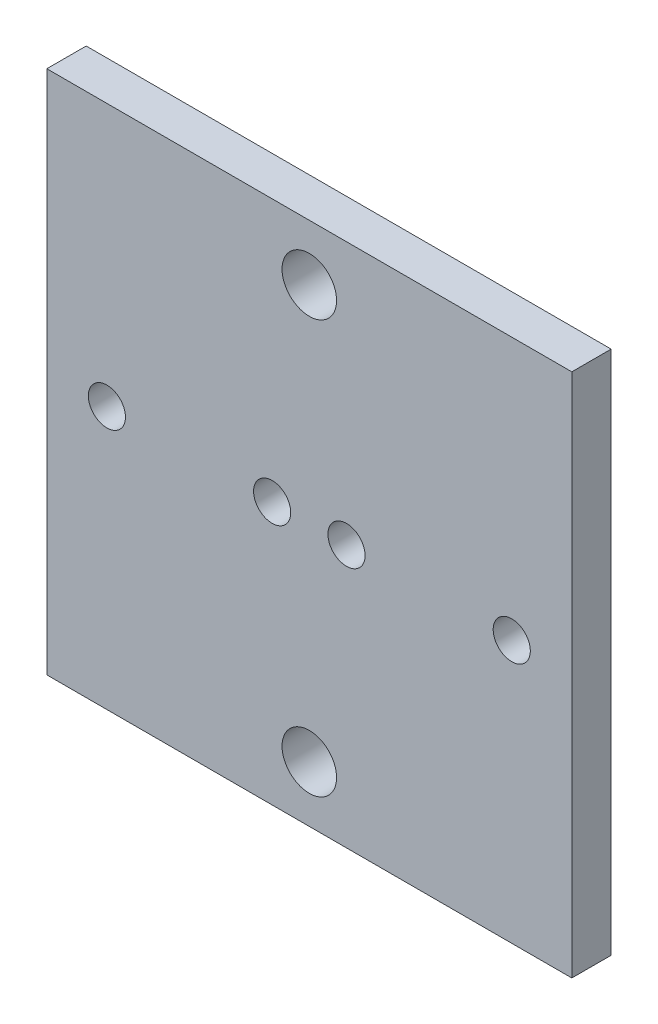
ISO-10303-21;
HEADER;
FILE_DESCRIPTION(('STEP AP214'),'2;1');
FILE_NAME('part.step','',(''),(''),'','','');
FILE_SCHEMA(('AUTOMOTIVE_DESIGN { 1 0 10303 214 1 1 1 1 }'));
ENDSEC;
DATA;
#1=APPLICATION_CONTEXT('core data for automotive mechanical design processes');
#2=APPLICATION_PROTOCOL_DEFINITION('international standard','automotive_design',2000,#1);
#3=PRODUCT_CONTEXT('',#1,'mechanical');
#4=PRODUCT('Part','Part','',(#3));
#5=PRODUCT_RELATED_PRODUCT_CATEGORY('part','',(#4));
#6=PRODUCT_DEFINITION_FORMATION('','',#4);
#7=PRODUCT_DEFINITION_CONTEXT('part definition',#1,'design');
#8=PRODUCT_DEFINITION('design','',#6,#7);
#9=PRODUCT_DEFINITION_SHAPE('','',#8);
#10=(LENGTH_UNIT() NAMED_UNIT(*) SI_UNIT(.MILLI.,.METRE.));
#11=(NAMED_UNIT(*) PLANE_ANGLE_UNIT() SI_UNIT($,.RADIAN.));
#12=(NAMED_UNIT(*) SI_UNIT($,.STERADIAN.) SOLID_ANGLE_UNIT());
#13=UNCERTAINTY_MEASURE_WITH_UNIT(LENGTH_MEASURE(1.E-05),#10,'distance_accuracy_value','');
#14=(GEOMETRIC_REPRESENTATION_CONTEXT(3) GLOBAL_UNCERTAINTY_ASSIGNED_CONTEXT((#13)) GLOBAL_UNIT_ASSIGNED_CONTEXT((#10,
#11,#12)) REPRESENTATION_CONTEXT('',''));
#15=CARTESIAN_POINT('',(0.,0.,0.));
#16=DIRECTION('',(0.,0.,1.));
#17=DIRECTION('',(1.,0.,0.));
#18=AXIS2_PLACEMENT_3D('',#15,#16,#17);
#19=CARTESIAN_POINT('',(-24.5,0.,4.7625));
#20=DIRECTION('',(0.,0.,-1.));
#21=DIRECTION('',(-1.,0.,0.));
#22=AXIS2_PLACEMENT_3D('',#19,#20,#21);
#23=CYLINDRICAL_SURFACE('',#22,2.2479);
#24=CARTESIAN_POINT('',(-24.5,0.,4.7625));
#25=DIRECTION('',(0.,0.,1.));
#26=DIRECTION('',(1.,0.,0.));
#27=AXIS2_PLACEMENT_3D('',#24,#25,#26);
#28=CIRCLE('',#27,2.2479);
#29=CARTESIAN_POINT('',(-26.7479,0.,4.7625));
#30=VERTEX_POINT('',#29);
#31=EDGE_CURVE('E51',#30,#30,#28,.T.);
#32=CARTESIAN_POINT('',(-24.5,0.,0.));
#33=DIRECTION('',(0.,0.,1.));
#34=DIRECTION('',(1.,0.,0.));
#35=AXIS2_PLACEMENT_3D('',#32,#33,#34);
#36=CIRCLE('',#35,2.2479);
#37=CARTESIAN_POINT('',(-26.7479,0.,0.));
#38=VERTEX_POINT('',#37);
#39=EDGE_CURVE('E168',#38,#38,#36,.T.);
#40=CARTESIAN_POINT('',(-26.7479,0.,4.7625));
#41=CARTESIAN_POINT('',(-26.7479,0.,4.712890625));
#42=CARTESIAN_POINT('',(-26.7479,0.,4.66328125));
#43=CARTESIAN_POINT('',(-26.7479,0.,4.5640625));
#44=CARTESIAN_POINT('',(-26.7479,0.,4.514453125));
#45=CARTESIAN_POINT('',(-26.7479,0.,4.415234375));
#46=CARTESIAN_POINT('',(-26.7479,0.,4.365625));
#47=CARTESIAN_POINT('',(-26.7479,0.,4.26640625));
#48=CARTESIAN_POINT('',(-26.7479,0.,4.216796875));
#49=CARTESIAN_POINT('',(-26.7479,0.,4.117578125));
#50=CARTESIAN_POINT('',(-26.7479,0.,4.06796875));
#51=CARTESIAN_POINT('',(-26.7479,0.,3.96875));
#52=CARTESIAN_POINT('',(-26.7479,0.,3.919140625));
#53=CARTESIAN_POINT('',(-26.7479,0.,3.819921875));
#54=CARTESIAN_POINT('',(-26.7479,0.,3.7703125));
#55=CARTESIAN_POINT('',(-26.7479,0.,3.67109375));
#56=CARTESIAN_POINT('',(-26.7479,0.,3.621484375));
#57=CARTESIAN_POINT('',(-26.7479,0.,3.522265625));
#58=CARTESIAN_POINT('',(-26.7479,0.,3.47265625));
#59=CARTESIAN_POINT('',(-26.7479,0.,3.3734375));
#60=CARTESIAN_POINT('',(-26.7479,0.,3.323828125));
#61=CARTESIAN_POINT('',(-26.7479,0.,3.224609375));
#62=CARTESIAN_POINT('',(-26.7479,0.,3.175));
#63=CARTESIAN_POINT('',(-26.7479,0.,3.07578125));
#64=CARTESIAN_POINT('',(-26.7479,0.,3.026171875));
#65=CARTESIAN_POINT('',(-26.7479,0.,2.926953125));
#66=CARTESIAN_POINT('',(-26.7479,0.,2.87734375));
#67=CARTESIAN_POINT('',(-26.7479,0.,2.778125));
#68=CARTESIAN_POINT('',(-26.7479,0.,2.728515625));
#69=CARTESIAN_POINT('',(-26.7479,0.,2.629296875));
#70=CARTESIAN_POINT('',(-26.7479,0.,2.5796875));
#71=CARTESIAN_POINT('',(-26.7479,0.,2.48046875));
#72=CARTESIAN_POINT('',(-26.7479,0.,2.430859375));
#73=CARTESIAN_POINT('',(-26.7479,0.,2.331640625));
#74=CARTESIAN_POINT('',(-26.7479,0.,2.28203125));
#75=CARTESIAN_POINT('',(-26.7479,0.,2.1828125));
#76=CARTESIAN_POINT('',(-26.7479,0.,2.133203125));
#77=CARTESIAN_POINT('',(-26.7479,0.,2.033984375));
#78=CARTESIAN_POINT('',(-26.7479,0.,1.984375));
#79=CARTESIAN_POINT('',(-26.7479,0.,1.88515625));
#80=CARTESIAN_POINT('',(-26.7479,0.,1.835546875));
#81=CARTESIAN_POINT('',(-26.7479,0.,1.736328125));
#82=CARTESIAN_POINT('',(-26.7479,0.,1.68671875));
#83=CARTESIAN_POINT('',(-26.7479,0.,1.5875));
#84=CARTESIAN_POINT('',(-26.7479,0.,1.537890625));
#85=CARTESIAN_POINT('',(-26.7479,0.,1.438671875));
#86=CARTESIAN_POINT('',(-26.7479,0.,1.3890625));
#87=CARTESIAN_POINT('',(-26.7479,0.,1.28984375));
#88=CARTESIAN_POINT('',(-26.7479,0.,1.240234375));
#89=CARTESIAN_POINT('',(-26.7479,0.,1.141015625));
#90=CARTESIAN_POINT('',(-26.7479,0.,1.09140625));
#91=CARTESIAN_POINT('',(-26.7479,0.,0.9921875));
#92=CARTESIAN_POINT('',(-26.7479,0.,0.942578125));
#93=CARTESIAN_POINT('',(-26.7479,0.,0.843359375));
#94=CARTESIAN_POINT('',(-26.7479,0.,0.79375));
#95=CARTESIAN_POINT('',(-26.7479,0.,0.69453125));
#96=CARTESIAN_POINT('',(-26.7479,0.,0.644921875));
#97=CARTESIAN_POINT('',(-26.7479,0.,0.545703125));
#98=CARTESIAN_POINT('',(-26.7479,0.,0.49609375));
#99=CARTESIAN_POINT('',(-26.7479,0.,0.396875));
#100=CARTESIAN_POINT('',(-26.7479,0.,0.347265625));
#101=CARTESIAN_POINT('',(-26.7479,0.,0.248046875));
#102=CARTESIAN_POINT('',(-26.7479,0.,0.1984375));
#103=CARTESIAN_POINT('',(-26.7479,0.,0.09921875));
#104=CARTESIAN_POINT('',(-26.7479,0.,0.049609375));
#105=CARTESIAN_POINT('',(-26.7479,0.,0.));
#106=B_SPLINE_CURVE_WITH_KNOTS('',3,(#40,#41,#42,#43,#44,#45,#46,#47,#48,#49,#50,#51,#52,#53,
#54,#55,#56,#57,#58,#59,#60,#61,#62,#63,#64,#65,#66,#67,#68,#69,#70,#71,#72,#73,#74,#75,#76,#77,
#78,#79,#80,#81,#82,#83,#84,#85,#86,#87,#88,#89,#90,#91,#92,#93,#94,#95,#96,#97,#98,#99,#100,
#101,#102,#103,#104,#105),.UNSPECIFIED.,.F.,.F.,(4,2,2,2,2,2,2,2,2,2,2,2,2,2,2,2,2,2,2,2,2,2,2,
2,2,2,2,2,2,2,2,2,4),(0.,0.148828124999999,0.297656249999999,0.446484374999999,
0.595312499999999,0.744140625,0.89296875,1.041796875,1.190625,1.339453125,1.48828125,
1.637109375,1.7859375,1.934765625,2.08359375,2.232421875,2.38125,2.530078125,2.67890625,
2.827734375,2.9765625,3.125390625,3.27421875,3.423046875,3.571875,3.720703125,3.86953125,
4.018359375,4.1671875,4.316015625,4.46484375,4.613671875,4.7625),.UNSPECIFIED.);
#107=EDGE_CURVE('BSEAM41',#30,#38,#106,.T.);
#108=ORIENTED_EDGE('',*,*,#31,.T.);
#109=ORIENTED_EDGE('',*,*,#39,.F.);
#110=ORIENTED_EDGE('',*,*,#107,.T.);
#111=ORIENTED_EDGE('',*,*,#107,.F.);
#112=EDGE_LOOP('',(#108,#110,#109,#111));
#113=FACE_BOUND('',#112,.T.);
#114=ADVANCED_FACE('F41',(#113),#23,.F.);
#115=CARTESIAN_POINT('',(-4.5,0.,4.7625));
#116=DIRECTION('',(0.,0.,-1.));
#117=DIRECTION('',(-1.,0.,0.));
#118=AXIS2_PLACEMENT_3D('',#115,#116,#117);
#119=CYLINDRICAL_SURFACE('',#118,2.2479);
#120=CARTESIAN_POINT('',(-4.5,0.,4.7625));
#121=DIRECTION('',(0.,0.,1.));
#122=DIRECTION('',(1.,0.,0.));
#123=AXIS2_PLACEMENT_3D('',#120,#121,#122);
#124=CIRCLE('',#123,2.2479);
#125=CARTESIAN_POINT('',(-6.7479,0.,4.7625));
#126=VERTEX_POINT('',#125);
#127=EDGE_CURVE('E147',#126,#126,#124,.T.);
#128=CARTESIAN_POINT('',(-4.5,0.,0.));
#129=DIRECTION('',(0.,0.,1.));
#130=DIRECTION('',(1.,0.,0.));
#131=AXIS2_PLACEMENT_3D('',#128,#129,#130);
#132=CIRCLE('',#131,2.2479);
#133=CARTESIAN_POINT('',(-6.7479,0.,0.));
#134=VERTEX_POINT('',#133);
#135=EDGE_CURVE('E165',#134,#134,#132,.T.);
#136=CARTESIAN_POINT('',(-6.7479,0.,4.7625));
#137=CARTESIAN_POINT('',(-6.7479,0.,4.712890625));
#138=CARTESIAN_POINT('',(-6.7479,0.,4.66328125));
#139=CARTESIAN_POINT('',(-6.7479,0.,4.5640625));
#140=CARTESIAN_POINT('',(-6.7479,0.,4.514453125));
#141=CARTESIAN_POINT('',(-6.7479,0.,4.415234375));
#142=CARTESIAN_POINT('',(-6.7479,0.,4.365625));
#143=CARTESIAN_POINT('',(-6.7479,0.,4.26640625));
#144=CARTESIAN_POINT('',(-6.7479,0.,4.216796875));
#145=CARTESIAN_POINT('',(-6.7479,0.,4.117578125));
#146=CARTESIAN_POINT('',(-6.7479,0.,4.06796875));
#147=CARTESIAN_POINT('',(-6.7479,0.,3.96875));
#148=CARTESIAN_POINT('',(-6.7479,0.,3.919140625));
#149=CARTESIAN_POINT('',(-6.7479,0.,3.819921875));
#150=CARTESIAN_POINT('',(-6.7479,0.,3.7703125));
#151=CARTESIAN_POINT('',(-6.7479,0.,3.67109375));
#152=CARTESIAN_POINT('',(-6.7479,0.,3.621484375));
#153=CARTESIAN_POINT('',(-6.7479,0.,3.522265625));
#154=CARTESIAN_POINT('',(-6.7479,0.,3.47265625));
#155=CARTESIAN_POINT('',(-6.7479,0.,3.3734375));
#156=CARTESIAN_POINT('',(-6.7479,0.,3.323828125));
#157=CARTESIAN_POINT('',(-6.7479,0.,3.224609375));
#158=CARTESIAN_POINT('',(-6.7479,0.,3.175));
#159=CARTESIAN_POINT('',(-6.7479,0.,3.07578125));
#160=CARTESIAN_POINT('',(-6.7479,0.,3.026171875));
#161=CARTESIAN_POINT('',(-6.7479,0.,2.926953125));
#162=CARTESIAN_POINT('',(-6.7479,0.,2.87734375));
#163=CARTESIAN_POINT('',(-6.7479,0.,2.778125));
#164=CARTESIAN_POINT('',(-6.7479,0.,2.728515625));
#165=CARTESIAN_POINT('',(-6.7479,0.,2.629296875));
#166=CARTESIAN_POINT('',(-6.7479,0.,2.5796875));
#167=CARTESIAN_POINT('',(-6.7479,0.,2.48046875));
#168=CARTESIAN_POINT('',(-6.7479,0.,2.430859375));
#169=CARTESIAN_POINT('',(-6.7479,0.,2.331640625));
#170=CARTESIAN_POINT('',(-6.7479,0.,2.28203125));
#171=CARTESIAN_POINT('',(-6.7479,0.,2.1828125));
#172=CARTESIAN_POINT('',(-6.7479,0.,2.133203125));
#173=CARTESIAN_POINT('',(-6.7479,0.,2.033984375));
#174=CARTESIAN_POINT('',(-6.7479,0.,1.984375));
#175=CARTESIAN_POINT('',(-6.7479,0.,1.88515625));
#176=CARTESIAN_POINT('',(-6.7479,0.,1.835546875));
#177=CARTESIAN_POINT('',(-6.7479,0.,1.736328125));
#178=CARTESIAN_POINT('',(-6.7479,0.,1.68671875));
#179=CARTESIAN_POINT('',(-6.7479,0.,1.5875));
#180=CARTESIAN_POINT('',(-6.7479,0.,1.537890625));
#181=CARTESIAN_POINT('',(-6.7479,0.,1.438671875));
#182=CARTESIAN_POINT('',(-6.7479,0.,1.3890625));
#183=CARTESIAN_POINT('',(-6.7479,0.,1.28984375));
#184=CARTESIAN_POINT('',(-6.7479,0.,1.240234375));
#185=CARTESIAN_POINT('',(-6.7479,0.,1.141015625));
#186=CARTESIAN_POINT('',(-6.7479,0.,1.09140625));
#187=CARTESIAN_POINT('',(-6.7479,0.,0.9921875));
#188=CARTESIAN_POINT('',(-6.7479,0.,0.942578125));
#189=CARTESIAN_POINT('',(-6.7479,0.,0.843359375));
#190=CARTESIAN_POINT('',(-6.7479,0.,0.79375));
#191=CARTESIAN_POINT('',(-6.7479,0.,0.69453125));
#192=CARTESIAN_POINT('',(-6.7479,0.,0.644921875));
#193=CARTESIAN_POINT('',(-6.7479,0.,0.545703125));
#194=CARTESIAN_POINT('',(-6.7479,0.,0.49609375));
#195=CARTESIAN_POINT('',(-6.7479,0.,0.396875));
#196=CARTESIAN_POINT('',(-6.7479,0.,0.347265625));
#197=CARTESIAN_POINT('',(-6.7479,0.,0.248046875));
#198=CARTESIAN_POINT('',(-6.7479,0.,0.1984375));
#199=CARTESIAN_POINT('',(-6.7479,0.,0.09921875));
#200=CARTESIAN_POINT('',(-6.7479,0.,0.049609375));
#201=CARTESIAN_POINT('',(-6.7479,0.,0.));
#202=B_SPLINE_CURVE_WITH_KNOTS('',3,(#136,#137,#138,#139,#140,#141,#142,#143,#144,#145,#146,
#147,#148,#149,#150,#151,#152,#153,#154,#155,#156,#157,#158,#159,#160,#161,#162,#163,#164,#165,
#166,#167,#168,#169,#170,#171,#172,#173,#174,#175,#176,#177,#178,#179,#180,#181,#182,#183,#184,
#185,#186,#187,#188,#189,#190,#191,#192,#193,#194,#195,#196,#197,#198,#199,#200,#201),
.UNSPECIFIED.,.F.,.F.,(4,2,2,2,2,2,2,2,2,2,2,2,2,2,2,2,2,2,2,2,2,2,2,2,2,2,2,2,2,2,2,2,4),(0.,
0.148828124999999,0.297656249999999,0.446484374999999,0.595312499999999,0.744140625,0.89296875,
1.041796875,1.190625,1.339453125,1.48828125,1.637109375,1.7859375,1.934765625,2.08359375,
2.232421875,2.38125,2.530078125,2.67890625,2.827734375,2.9765625,3.125390625,3.27421875,
3.423046875,3.571875,3.720703125,3.86953125,4.018359375,4.1671875,4.316015625,4.46484375,
4.613671875,4.7625),.UNSPECIFIED.);
#203=EDGE_CURVE('BSEAM193',#126,#134,#202,.T.);
#204=ORIENTED_EDGE('',*,*,#127,.T.);
#205=ORIENTED_EDGE('',*,*,#135,.F.);
#206=ORIENTED_EDGE('',*,*,#203,.T.);
#207=ORIENTED_EDGE('',*,*,#203,.F.);
#208=EDGE_LOOP('',(#204,#206,#205,#207));
#209=FACE_BOUND('',#208,.T.);
#210=ADVANCED_FACE('F193',(#209),#119,.F.);
#211=CARTESIAN_POINT('',(4.5,0.,4.7625));
#212=DIRECTION('',(0.,0.,-1.));
#213=DIRECTION('',(-1.,0.,0.));
#214=AXIS2_PLACEMENT_3D('',#211,#212,#213);
#215=CYLINDRICAL_SURFACE('',#214,2.2479);
#216=CARTESIAN_POINT('',(4.5,0.,4.7625));
#217=DIRECTION('',(0.,0.,1.));
#218=DIRECTION('',(1.,0.,0.));
#219=AXIS2_PLACEMENT_3D('',#216,#217,#218);
#220=CIRCLE('',#219,2.2479);
#221=CARTESIAN_POINT('',(2.2521,0.,4.7625));
#222=VERTEX_POINT('',#221);
#223=EDGE_CURVE('E143',#222,#222,#220,.T.);
#224=CARTESIAN_POINT('',(4.5,0.,0.));
#225=DIRECTION('',(0.,0.,1.));
#226=DIRECTION('',(1.,0.,0.));
#227=AXIS2_PLACEMENT_3D('',#224,#225,#226);
#228=CIRCLE('',#227,2.2479);
#229=CARTESIAN_POINT('',(2.2521,0.,0.));
#230=VERTEX_POINT('',#229);
#231=EDGE_CURVE('E161',#230,#230,#228,.T.);
#232=CARTESIAN_POINT('',(2.2521,0.,4.7625));
#233=CARTESIAN_POINT('',(2.2521,0.,4.712890625));
#234=CARTESIAN_POINT('',(2.2521,0.,4.66328125));
#235=CARTESIAN_POINT('',(2.2521,0.,4.5640625));
#236=CARTESIAN_POINT('',(2.2521,0.,4.514453125));
#237=CARTESIAN_POINT('',(2.2521,0.,4.415234375));
#238=CARTESIAN_POINT('',(2.2521,0.,4.365625));
#239=CARTESIAN_POINT('',(2.2521,0.,4.26640625));
#240=CARTESIAN_POINT('',(2.2521,0.,4.216796875));
#241=CARTESIAN_POINT('',(2.2521,0.,4.117578125));
#242=CARTESIAN_POINT('',(2.2521,0.,4.06796875));
#243=CARTESIAN_POINT('',(2.2521,0.,3.96875));
#244=CARTESIAN_POINT('',(2.2521,0.,3.919140625));
#245=CARTESIAN_POINT('',(2.2521,0.,3.819921875));
#246=CARTESIAN_POINT('',(2.2521,0.,3.7703125));
#247=CARTESIAN_POINT('',(2.2521,0.,3.67109375));
#248=CARTESIAN_POINT('',(2.2521,0.,3.621484375));
#249=CARTESIAN_POINT('',(2.2521,0.,3.522265625));
#250=CARTESIAN_POINT('',(2.2521,0.,3.47265625));
#251=CARTESIAN_POINT('',(2.2521,0.,3.3734375));
#252=CARTESIAN_POINT('',(2.2521,0.,3.323828125));
#253=CARTESIAN_POINT('',(2.2521,0.,3.224609375));
#254=CARTESIAN_POINT('',(2.2521,0.,3.175));
#255=CARTESIAN_POINT('',(2.2521,0.,3.07578125));
#256=CARTESIAN_POINT('',(2.2521,0.,3.026171875));
#257=CARTESIAN_POINT('',(2.2521,0.,2.926953125));
#258=CARTESIAN_POINT('',(2.2521,0.,2.87734375));
#259=CARTESIAN_POINT('',(2.2521,0.,2.778125));
#260=CARTESIAN_POINT('',(2.2521,0.,2.728515625));
#261=CARTESIAN_POINT('',(2.2521,0.,2.629296875));
#262=CARTESIAN_POINT('',(2.2521,0.,2.5796875));
#263=CARTESIAN_POINT('',(2.2521,0.,2.48046875));
#264=CARTESIAN_POINT('',(2.2521,0.,2.430859375));
#265=CARTESIAN_POINT('',(2.2521,0.,2.331640625));
#266=CARTESIAN_POINT('',(2.2521,0.,2.28203125));
#267=CARTESIAN_POINT('',(2.2521,0.,2.1828125));
#268=CARTESIAN_POINT('',(2.2521,0.,2.133203125));
#269=CARTESIAN_POINT('',(2.2521,0.,2.033984375));
#270=CARTESIAN_POINT('',(2.2521,0.,1.984375));
#271=CARTESIAN_POINT('',(2.2521,0.,1.88515625));
#272=CARTESIAN_POINT('',(2.2521,0.,1.835546875));
#273=CARTESIAN_POINT('',(2.2521,0.,1.736328125));
#274=CARTESIAN_POINT('',(2.2521,0.,1.68671875));
#275=CARTESIAN_POINT('',(2.2521,0.,1.5875));
#276=CARTESIAN_POINT('',(2.2521,0.,1.537890625));
#277=CARTESIAN_POINT('',(2.2521,0.,1.438671875));
#278=CARTESIAN_POINT('',(2.2521,0.,1.3890625));
#279=CARTESIAN_POINT('',(2.2521,0.,1.28984375));
#280=CARTESIAN_POINT('',(2.2521,0.,1.240234375));
#281=CARTESIAN_POINT('',(2.2521,0.,1.141015625));
#282=CARTESIAN_POINT('',(2.2521,0.,1.09140625));
#283=CARTESIAN_POINT('',(2.2521,0.,0.9921875));
#284=CARTESIAN_POINT('',(2.2521,0.,0.942578125));
#285=CARTESIAN_POINT('',(2.2521,0.,0.843359375));
#286=CARTESIAN_POINT('',(2.2521,0.,0.79375));
#287=CARTESIAN_POINT('',(2.2521,0.,0.69453125));
#288=CARTESIAN_POINT('',(2.2521,0.,0.644921875));
#289=CARTESIAN_POINT('',(2.2521,0.,0.545703125));
#290=CARTESIAN_POINT('',(2.2521,0.,0.49609375));
#291=CARTESIAN_POINT('',(2.2521,0.,0.396875));
#292=CARTESIAN_POINT('',(2.2521,0.,0.347265625));
#293=CARTESIAN_POINT('',(2.2521,0.,0.248046875));
#294=CARTESIAN_POINT('',(2.2521,0.,0.1984375));
#295=CARTESIAN_POINT('',(2.2521,0.,0.09921875));
#296=CARTESIAN_POINT('',(2.2521,0.,0.049609375));
#297=CARTESIAN_POINT('',(2.2521,0.,0.));
#298=B_SPLINE_CURVE_WITH_KNOTS('',3,(#232,#233,#234,#235,#236,#237,#238,#239,#240,#241,#242,
#243,#244,#245,#246,#247,#248,#249,#250,#251,#252,#253,#254,#255,#256,#257,#258,#259,#260,#261,
#262,#263,#264,#265,#266,#267,#268,#269,#270,#271,#272,#273,#274,#275,#276,#277,#278,#279,#280,
#281,#282,#283,#284,#285,#286,#287,#288,#289,#290,#291,#292,#293,#294,#295,#296,#297),
.UNSPECIFIED.,.F.,.F.,(4,2,2,2,2,2,2,2,2,2,2,2,2,2,2,2,2,2,2,2,2,2,2,2,2,2,2,2,2,2,2,2,4),(0.,
0.148828124999999,0.297656249999999,0.446484374999999,0.595312499999999,0.744140625,0.89296875,
1.041796875,1.190625,1.339453125,1.48828125,1.637109375,1.7859375,1.934765625,2.08359375,
2.232421875,2.38125,2.530078125,2.67890625,2.827734375,2.9765625,3.125390625,3.27421875,
3.423046875,3.571875,3.720703125,3.86953125,4.018359375,4.1671875,4.316015625,4.46484375,
4.613671875,4.7625),.UNSPECIFIED.);
#299=EDGE_CURVE('BSEAM198',#222,#230,#298,.T.);
#300=ORIENTED_EDGE('',*,*,#223,.T.);
#301=ORIENTED_EDGE('',*,*,#231,.F.);
#302=ORIENTED_EDGE('',*,*,#299,.T.);
#303=ORIENTED_EDGE('',*,*,#299,.F.);
#304=EDGE_LOOP('',(#300,#302,#301,#303));
#305=FACE_BOUND('',#304,.T.);
#306=ADVANCED_FACE('F198',(#305),#215,.F.);
#307=CARTESIAN_POINT('',(24.5,0.,4.7625));
#308=DIRECTION('',(0.,0.,-1.));
#309=DIRECTION('',(-1.,0.,0.));
#310=AXIS2_PLACEMENT_3D('',#307,#308,#309);
#311=CYLINDRICAL_SURFACE('',#310,2.2479);
#312=CARTESIAN_POINT('',(24.5,0.,4.7625));
#313=DIRECTION('',(0.,0.,1.));
#314=DIRECTION('',(1.,0.,0.));
#315=AXIS2_PLACEMENT_3D('',#312,#313,#314);
#316=CIRCLE('',#315,2.2479);
#317=CARTESIAN_POINT('',(22.2521,0.,4.7625));
#318=VERTEX_POINT('',#317);
#319=EDGE_CURVE('E139',#318,#318,#316,.T.);
#320=CARTESIAN_POINT('',(24.5,0.,0.));
#321=DIRECTION('',(0.,0.,1.));
#322=DIRECTION('',(1.,0.,0.));
#323=AXIS2_PLACEMENT_3D('',#320,#321,#322);
#324=CIRCLE('',#323,2.2479);
#325=CARTESIAN_POINT('',(22.2521,0.,0.));
#326=VERTEX_POINT('',#325);
#327=EDGE_CURVE('E157',#326,#326,#324,.T.);
#328=CARTESIAN_POINT('',(22.2521,0.,4.7625));
#329=CARTESIAN_POINT('',(22.2521,0.,4.712890625));
#330=CARTESIAN_POINT('',(22.2521,0.,4.66328125));
#331=CARTESIAN_POINT('',(22.2521,0.,4.5640625));
#332=CARTESIAN_POINT('',(22.2521,0.,4.514453125));
#333=CARTESIAN_POINT('',(22.2521,0.,4.415234375));
#334=CARTESIAN_POINT('',(22.2521,0.,4.365625));
#335=CARTESIAN_POINT('',(22.2521,0.,4.26640625));
#336=CARTESIAN_POINT('',(22.2521,0.,4.216796875));
#337=CARTESIAN_POINT('',(22.2521,0.,4.117578125));
#338=CARTESIAN_POINT('',(22.2521,0.,4.06796875));
#339=CARTESIAN_POINT('',(22.2521,0.,3.96875));
#340=CARTESIAN_POINT('',(22.2521,0.,3.919140625));
#341=CARTESIAN_POINT('',(22.2521,0.,3.819921875));
#342=CARTESIAN_POINT('',(22.2521,0.,3.7703125));
#343=CARTESIAN_POINT('',(22.2521,0.,3.67109375));
#344=CARTESIAN_POINT('',(22.2521,0.,3.621484375));
#345=CARTESIAN_POINT('',(22.2521,0.,3.522265625));
#346=CARTESIAN_POINT('',(22.2521,0.,3.47265625));
#347=CARTESIAN_POINT('',(22.2521,0.,3.3734375));
#348=CARTESIAN_POINT('',(22.2521,0.,3.323828125));
#349=CARTESIAN_POINT('',(22.2521,0.,3.224609375));
#350=CARTESIAN_POINT('',(22.2521,0.,3.175));
#351=CARTESIAN_POINT('',(22.2521,0.,3.07578125));
#352=CARTESIAN_POINT('',(22.2521,0.,3.026171875));
#353=CARTESIAN_POINT('',(22.2521,0.,2.926953125));
#354=CARTESIAN_POINT('',(22.2521,0.,2.87734375));
#355=CARTESIAN_POINT('',(22.2521,0.,2.778125));
#356=CARTESIAN_POINT('',(22.2521,0.,2.728515625));
#357=CARTESIAN_POINT('',(22.2521,0.,2.629296875));
#358=CARTESIAN_POINT('',(22.2521,0.,2.5796875));
#359=CARTESIAN_POINT('',(22.2521,0.,2.48046875));
#360=CARTESIAN_POINT('',(22.2521,0.,2.430859375));
#361=CARTESIAN_POINT('',(22.2521,0.,2.331640625));
#362=CARTESIAN_POINT('',(22.2521,0.,2.28203125));
#363=CARTESIAN_POINT('',(22.2521,0.,2.1828125));
#364=CARTESIAN_POINT('',(22.2521,0.,2.133203125));
#365=CARTESIAN_POINT('',(22.2521,0.,2.033984375));
#366=CARTESIAN_POINT('',(22.2521,0.,1.984375));
#367=CARTESIAN_POINT('',(22.2521,0.,1.88515625));
#368=CARTESIAN_POINT('',(22.2521,0.,1.835546875));
#369=CARTESIAN_POINT('',(22.2521,0.,1.736328125));
#370=CARTESIAN_POINT('',(22.2521,0.,1.68671875));
#371=CARTESIAN_POINT('',(22.2521,0.,1.5875));
#372=CARTESIAN_POINT('',(22.2521,0.,1.537890625));
#373=CARTESIAN_POINT('',(22.2521,0.,1.438671875));
#374=CARTESIAN_POINT('',(22.2521,0.,1.3890625));
#375=CARTESIAN_POINT('',(22.2521,0.,1.28984375));
#376=CARTESIAN_POINT('',(22.2521,0.,1.240234375));
#377=CARTESIAN_POINT('',(22.2521,0.,1.141015625));
#378=CARTESIAN_POINT('',(22.2521,0.,1.09140625));
#379=CARTESIAN_POINT('',(22.2521,0.,0.9921875));
#380=CARTESIAN_POINT('',(22.2521,0.,0.942578125));
#381=CARTESIAN_POINT('',(22.2521,0.,0.843359375));
#382=CARTESIAN_POINT('',(22.2521,0.,0.79375));
#383=CARTESIAN_POINT('',(22.2521,0.,0.69453125));
#384=CARTESIAN_POINT('',(22.2521,0.,0.644921875));
#385=CARTESIAN_POINT('',(22.2521,0.,0.545703125));
#386=CARTESIAN_POINT('',(22.2521,0.,0.49609375));
#387=CARTESIAN_POINT('',(22.2521,0.,0.396875));
#388=CARTESIAN_POINT('',(22.2521,0.,0.347265625));
#389=CARTESIAN_POINT('',(22.2521,0.,0.248046875));
#390=CARTESIAN_POINT('',(22.2521,0.,0.1984375));
#391=CARTESIAN_POINT('',(22.2521,0.,0.09921875));
#392=CARTESIAN_POINT('',(22.2521,0.,0.049609375));
#393=CARTESIAN_POINT('',(22.2521,0.,0.));
#394=B_SPLINE_CURVE_WITH_KNOTS('',3,(#328,#329,#330,#331,#332,#333,#334,#335,#336,#337,#338,
#339,#340,#341,#342,#343,#344,#345,#346,#347,#348,#349,#350,#351,#352,#353,#354,#355,#356,#357,
#358,#359,#360,#361,#362,#363,#364,#365,#366,#367,#368,#369,#370,#371,#372,#373,#374,#375,#376,
#377,#378,#379,#380,#381,#382,#383,#384,#385,#386,#387,#388,#389,#390,#391,#392,#393),
.UNSPECIFIED.,.F.,.F.,(4,2,2,2,2,2,2,2,2,2,2,2,2,2,2,2,2,2,2,2,2,2,2,2,2,2,2,2,2,2,2,2,4),(0.,
0.148828124999999,0.297656249999999,0.446484374999999,0.595312499999999,0.744140625,0.89296875,
1.041796875,1.190625,1.339453125,1.48828125,1.637109375,1.7859375,1.934765625,2.08359375,
2.232421875,2.38125,2.530078125,2.67890625,2.827734375,2.9765625,3.125390625,3.27421875,
3.423046875,3.571875,3.720703125,3.86953125,4.018359375,4.1671875,4.316015625,4.46484375,
4.613671875,4.7625),.UNSPECIFIED.);
#395=EDGE_CURVE('BSEAM188',#318,#326,#394,.T.);
#396=ORIENTED_EDGE('',*,*,#319,.T.);
#397=ORIENTED_EDGE('',*,*,#327,.F.);
#398=ORIENTED_EDGE('',*,*,#395,.T.);
#399=ORIENTED_EDGE('',*,*,#395,.F.);
#400=EDGE_LOOP('',(#396,#398,#397,#399));
#401=FACE_BOUND('',#400,.T.);
#402=ADVANCED_FACE('F188',(#401),#311,.F.);
#403=CARTESIAN_POINT('',(0.,-25.,4.7625));
#404=DIRECTION('',(0.,0.,-1.));
#405=DIRECTION('',(-1.,0.,0.));
#406=AXIS2_PLACEMENT_3D('',#403,#404,#405);
#407=CYLINDRICAL_SURFACE('',#406,3.3);
#408=CARTESIAN_POINT('',(0.,-25.,4.7625));
#409=DIRECTION('',(0.,0.,1.));
#410=DIRECTION('',(1.,0.,0.));
#411=AXIS2_PLACEMENT_3D('',#408,#409,#410);
#412=CIRCLE('',#411,3.3);
#413=CARTESIAN_POINT('',(-3.3,-25.,4.7625));
#414=VERTEX_POINT('',#413);
#415=EDGE_CURVE('E135',#414,#414,#412,.T.);
#416=CARTESIAN_POINT('',(0.,-25.,0.));
#417=DIRECTION('',(0.,0.,1.));
#418=DIRECTION('',(1.,0.,0.));
#419=AXIS2_PLACEMENT_3D('',#416,#417,#418);
#420=CIRCLE('',#419,3.3);
#421=CARTESIAN_POINT('',(-3.3,-25.,0.));
#422=VERTEX_POINT('',#421);
#423=EDGE_CURVE('E93',#422,#422,#420,.T.);
#424=CARTESIAN_POINT('',(-3.3,-25.,4.7625));
#425=CARTESIAN_POINT('',(-3.3,-25.,4.712890625));
#426=CARTESIAN_POINT('',(-3.3,-25.,4.66328125));
#427=CARTESIAN_POINT('',(-3.3,-25.,4.5640625));
#428=CARTESIAN_POINT('',(-3.3,-25.,4.514453125));
#429=CARTESIAN_POINT('',(-3.3,-25.,4.415234375));
#430=CARTESIAN_POINT('',(-3.3,-25.,4.365625));
#431=CARTESIAN_POINT('',(-3.3,-25.,4.26640625));
#432=CARTESIAN_POINT('',(-3.3,-25.,4.216796875));
#433=CARTESIAN_POINT('',(-3.3,-25.,4.117578125));
#434=CARTESIAN_POINT('',(-3.3,-25.,4.06796875));
#435=CARTESIAN_POINT('',(-3.3,-25.,3.96875));
#436=CARTESIAN_POINT('',(-3.3,-25.,3.919140625));
#437=CARTESIAN_POINT('',(-3.3,-25.,3.819921875));
#438=CARTESIAN_POINT('',(-3.3,-25.,3.7703125));
#439=CARTESIAN_POINT('',(-3.3,-25.,3.67109375));
#440=CARTESIAN_POINT('',(-3.3,-25.,3.621484375));
#441=CARTESIAN_POINT('',(-3.3,-25.,3.522265625));
#442=CARTESIAN_POINT('',(-3.3,-25.,3.47265625));
#443=CARTESIAN_POINT('',(-3.3,-25.,3.3734375));
#444=CARTESIAN_POINT('',(-3.3,-25.,3.323828125));
#445=CARTESIAN_POINT('',(-3.3,-25.,3.224609375));
#446=CARTESIAN_POINT('',(-3.3,-25.,3.175));
#447=CARTESIAN_POINT('',(-3.3,-25.,3.07578125));
#448=CARTESIAN_POINT('',(-3.3,-25.,3.026171875));
#449=CARTESIAN_POINT('',(-3.3,-25.,2.926953125));
#450=CARTESIAN_POINT('',(-3.3,-25.,2.87734375));
#451=CARTESIAN_POINT('',(-3.3,-25.,2.778125));
#452=CARTESIAN_POINT('',(-3.3,-25.,2.728515625));
#453=CARTESIAN_POINT('',(-3.3,-25.,2.629296875));
#454=CARTESIAN_POINT('',(-3.3,-25.,2.5796875));
#455=CARTESIAN_POINT('',(-3.3,-25.,2.48046875));
#456=CARTESIAN_POINT('',(-3.3,-25.,2.430859375));
#457=CARTESIAN_POINT('',(-3.3,-25.,2.331640625));
#458=CARTESIAN_POINT('',(-3.3,-25.,2.28203125));
#459=CARTESIAN_POINT('',(-3.3,-25.,2.1828125));
#460=CARTESIAN_POINT('',(-3.3,-25.,2.133203125));
#461=CARTESIAN_POINT('',(-3.3,-25.,2.033984375));
#462=CARTESIAN_POINT('',(-3.3,-25.,1.984375));
#463=CARTESIAN_POINT('',(-3.3,-25.,1.88515625));
#464=CARTESIAN_POINT('',(-3.3,-25.,1.835546875));
#465=CARTESIAN_POINT('',(-3.3,-25.,1.736328125));
#466=CARTESIAN_POINT('',(-3.3,-25.,1.68671875));
#467=CARTESIAN_POINT('',(-3.3,-25.,1.5875));
#468=CARTESIAN_POINT('',(-3.3,-25.,1.537890625));
#469=CARTESIAN_POINT('',(-3.3,-25.,1.438671875));
#470=CARTESIAN_POINT('',(-3.3,-25.,1.3890625));
#471=CARTESIAN_POINT('',(-3.3,-25.,1.28984375));
#472=CARTESIAN_POINT('',(-3.3,-25.,1.240234375));
#473=CARTESIAN_POINT('',(-3.3,-25.,1.141015625));
#474=CARTESIAN_POINT('',(-3.3,-25.,1.09140625));
#475=CARTESIAN_POINT('',(-3.3,-25.,0.992187499999999));
#476=CARTESIAN_POINT('',(-3.3,-25.,0.942578124999999));
#477=CARTESIAN_POINT('',(-3.3,-25.,0.843359375));
#478=CARTESIAN_POINT('',(-3.3,-25.,0.79375));
#479=CARTESIAN_POINT('',(-3.3,-25.,0.69453125));
#480=CARTESIAN_POINT('',(-3.3,-25.,0.644921875));
#481=CARTESIAN_POINT('',(-3.3,-25.,0.545703125));
#482=CARTESIAN_POINT('',(-3.3,-25.,0.49609375));
#483=CARTESIAN_POINT('',(-3.3,-25.,0.396875));
#484=CARTESIAN_POINT('',(-3.3,-25.,0.347265625));
#485=CARTESIAN_POINT('',(-3.3,-25.,0.248046875));
#486=CARTESIAN_POINT('',(-3.3,-25.,0.1984375));
#487=CARTESIAN_POINT('',(-3.3,-25.,0.09921875));
#488=CARTESIAN_POINT('',(-3.3,-25.,0.049609375));
#489=CARTESIAN_POINT('',(-3.3,-25.,0.));
#490=B_SPLINE_CURVE_WITH_KNOTS('',3,(#424,#425,#426,#427,#428,#429,#430,#431,#432,#433,#434,
#435,#436,#437,#438,#439,#440,#441,#442,#443,#444,#445,#446,#447,#448,#449,#450,#451,#452,#453,
#454,#455,#456,#457,#458,#459,#460,#461,#462,#463,#464,#465,#466,#467,#468,#469,#470,#471,#472,
#473,#474,#475,#476,#477,#478,#479,#480,#481,#482,#483,#484,#485,#486,#487,#488,#489),
.UNSPECIFIED.,.F.,.F.,(4,2,2,2,2,2,2,2,2,2,2,2,2,2,2,2,2,2,2,2,2,2,2,2,2,2,2,2,2,2,2,2,4),(0.,
0.148828125,0.29765625,0.446484375,0.5953125,0.744140625,0.892968750000001,1.041796875,1.190625,
1.339453125,1.48828125,1.637109375,1.7859375,1.934765625,2.08359375,2.232421875,2.38125,
2.530078125,2.67890625,2.827734375,2.9765625,3.125390625,3.27421875,3.423046875,3.571875,
3.720703125,3.86953125,4.018359375,4.1671875,4.316015625,4.46484375,4.613671875,4.7625),.UNSPECIFIED.);
#491=EDGE_CURVE('BSEAM43',#414,#422,#490,.T.);
#492=ORIENTED_EDGE('',*,*,#415,.T.);
#493=ORIENTED_EDGE('',*,*,#423,.F.);
#494=ORIENTED_EDGE('',*,*,#491,.T.);
#495=ORIENTED_EDGE('',*,*,#491,.F.);
#496=EDGE_LOOP('',(#492,#494,#493,#495));
#497=FACE_BOUND('',#496,.T.);
#498=ADVANCED_FACE('F43',(#497),#407,.F.);
#499=CARTESIAN_POINT('',(0.,25.,4.7625));
#500=DIRECTION('',(0.,0.,-1.));
#501=DIRECTION('',(-1.,0.,0.));
#502=AXIS2_PLACEMENT_3D('',#499,#500,#501);
#503=CYLINDRICAL_SURFACE('',#502,3.3);
#504=CARTESIAN_POINT('',(0.,25.,4.7625));
#505=DIRECTION('',(0.,0.,1.));
#506=DIRECTION('',(1.,0.,0.));
#507=AXIS2_PLACEMENT_3D('',#504,#505,#506);
#508=CIRCLE('',#507,3.3);
#509=CARTESIAN_POINT('',(-3.3,25.,4.7625));
#510=VERTEX_POINT('',#509);
#511=EDGE_CURVE('E11',#510,#510,#508,.T.);
#512=CARTESIAN_POINT('',(0.,25.,0.));
#513=DIRECTION('',(0.,0.,1.));
#514=DIRECTION('',(1.,0.,0.));
#515=AXIS2_PLACEMENT_3D('',#512,#513,#514);
#516=CIRCLE('',#515,3.3);
#517=CARTESIAN_POINT('',(-3.3,25.,0.));
#518=VERTEX_POINT('',#517);
#519=EDGE_CURVE('E45',#518,#518,#516,.T.);
#520=CARTESIAN_POINT('',(-3.3,25.,4.7625));
#521=CARTESIAN_POINT('',(-3.3,25.,4.712890625));
#522=CARTESIAN_POINT('',(-3.3,25.,4.66328125));
#523=CARTESIAN_POINT('',(-3.3,25.,4.5640625));
#524=CARTESIAN_POINT('',(-3.3,25.,4.514453125));
#525=CARTESIAN_POINT('',(-3.3,25.,4.415234375));
#526=CARTESIAN_POINT('',(-3.3,25.,4.365625));
#527=CARTESIAN_POINT('',(-3.3,25.,4.26640625));
#528=CARTESIAN_POINT('',(-3.3,25.,4.216796875));
#529=CARTESIAN_POINT('',(-3.3,25.,4.117578125));
#530=CARTESIAN_POINT('',(-3.3,25.,4.06796875));
#531=CARTESIAN_POINT('',(-3.3,25.,3.96875));
#532=CARTESIAN_POINT('',(-3.3,25.,3.919140625));
#533=CARTESIAN_POINT('',(-3.3,25.,3.819921875));
#534=CARTESIAN_POINT('',(-3.3,25.,3.7703125));
#535=CARTESIAN_POINT('',(-3.3,25.,3.67109375));
#536=CARTESIAN_POINT('',(-3.3,25.,3.621484375));
#537=CARTESIAN_POINT('',(-3.3,25.,3.522265625));
#538=CARTESIAN_POINT('',(-3.3,25.,3.47265625));
#539=CARTESIAN_POINT('',(-3.3,25.,3.3734375));
#540=CARTESIAN_POINT('',(-3.3,25.,3.323828125));
#541=CARTESIAN_POINT('',(-3.3,25.,3.224609375));
#542=CARTESIAN_POINT('',(-3.3,25.,3.175));
#543=CARTESIAN_POINT('',(-3.3,25.,3.07578125));
#544=CARTESIAN_POINT('',(-3.3,25.,3.026171875));
#545=CARTESIAN_POINT('',(-3.3,25.,2.926953125));
#546=CARTESIAN_POINT('',(-3.3,25.,2.87734375));
#547=CARTESIAN_POINT('',(-3.3,25.,2.778125));
#548=CARTESIAN_POINT('',(-3.3,25.,2.728515625));
#549=CARTESIAN_POINT('',(-3.3,25.,2.629296875));
#550=CARTESIAN_POINT('',(-3.3,25.,2.5796875));
#551=CARTESIAN_POINT('',(-3.3,25.,2.48046875));
#552=CARTESIAN_POINT('',(-3.3,25.,2.430859375));
#553=CARTESIAN_POINT('',(-3.3,25.,2.331640625));
#554=CARTESIAN_POINT('',(-3.3,25.,2.28203125));
#555=CARTESIAN_POINT('',(-3.3,25.,2.1828125));
#556=CARTESIAN_POINT('',(-3.3,25.,2.133203125));
#557=CARTESIAN_POINT('',(-3.3,25.,2.033984375));
#558=CARTESIAN_POINT('',(-3.3,25.,1.984375));
#559=CARTESIAN_POINT('',(-3.3,25.,1.88515625));
#560=CARTESIAN_POINT('',(-3.3,25.,1.835546875));
#561=CARTESIAN_POINT('',(-3.3,25.,1.736328125));
#562=CARTESIAN_POINT('',(-3.3,25.,1.68671875));
#563=CARTESIAN_POINT('',(-3.3,25.,1.5875));
#564=CARTESIAN_POINT('',(-3.3,25.,1.537890625));
#565=CARTESIAN_POINT('',(-3.3,25.,1.438671875));
#566=CARTESIAN_POINT('',(-3.3,25.,1.3890625));
#567=CARTESIAN_POINT('',(-3.3,25.,1.28984375));
#568=CARTESIAN_POINT('',(-3.3,25.,1.240234375));
#569=CARTESIAN_POINT('',(-3.3,25.,1.141015625));
#570=CARTESIAN_POINT('',(-3.3,25.,1.09140625));
#571=CARTESIAN_POINT('',(-3.3,25.,0.992187499999999));
#572=CARTESIAN_POINT('',(-3.3,25.,0.942578124999999));
#573=CARTESIAN_POINT('',(-3.3,25.,0.843359375));
#574=CARTESIAN_POINT('',(-3.3,25.,0.79375));
#575=CARTESIAN_POINT('',(-3.3,25.,0.69453125));
#576=CARTESIAN_POINT('',(-3.3,25.,0.644921875));
#577=CARTESIAN_POINT('',(-3.3,25.,0.545703125));
#578=CARTESIAN_POINT('',(-3.3,25.,0.49609375));
#579=CARTESIAN_POINT('',(-3.3,25.,0.396875));
#580=CARTESIAN_POINT('',(-3.3,25.,0.347265625));
#581=CARTESIAN_POINT('',(-3.3,25.,0.248046875));
#582=CARTESIAN_POINT('',(-3.3,25.,0.1984375));
#583=CARTESIAN_POINT('',(-3.3,25.,0.09921875));
#584=CARTESIAN_POINT('',(-3.3,25.,0.049609375));
#585=CARTESIAN_POINT('',(-3.3,25.,0.));
#586=B_SPLINE_CURVE_WITH_KNOTS('',3,(#520,#521,#522,#523,#524,#525,#526,#527,#528,#529,#530,
#531,#532,#533,#534,#535,#536,#537,#538,#539,#540,#541,#542,#543,#544,#545,#546,#547,#548,#549,
#550,#551,#552,#553,#554,#555,#556,#557,#558,#559,#560,#561,#562,#563,#564,#565,#566,#567,#568,
#569,#570,#571,#572,#573,#574,#575,#576,#577,#578,#579,#580,#581,#582,#583,#584,#585),
.UNSPECIFIED.,.F.,.F.,(4,2,2,2,2,2,2,2,2,2,2,2,2,2,2,2,2,2,2,2,2,2,2,2,2,2,2,2,2,2,2,2,4),(0.,
0.148828125,0.29765625,0.446484375,0.5953125,0.744140625,0.892968750000001,1.041796875,1.190625,
1.339453125,1.48828125,1.637109375,1.7859375,1.934765625,2.08359375,2.232421875,2.38125,
2.530078125,2.67890625,2.827734375,2.9765625,3.125390625,3.27421875,3.423046875,3.571875,
3.720703125,3.86953125,4.018359375,4.1671875,4.316015625,4.46484375,4.613671875,4.7625),.UNSPECIFIED.);
#587=EDGE_CURVE('BSEAM179',#510,#518,#586,.T.);
#588=ORIENTED_EDGE('',*,*,#511,.T.);
#589=ORIENTED_EDGE('',*,*,#519,.F.);
#590=ORIENTED_EDGE('',*,*,#587,.T.);
#591=ORIENTED_EDGE('',*,*,#587,.F.);
#592=EDGE_LOOP('',(#588,#590,#589,#591));
#593=FACE_BOUND('',#592,.T.);
#594=ADVANCED_FACE('F179',(#593),#503,.F.);
#595=CARTESIAN_POINT('',(0.,0.,4.7625));
#596=DIRECTION('',(0.,0.,1.));
#597=DIRECTION('',(1.,0.,0.));
#598=AXIS2_PLACEMENT_3D('',#595,#596,#597);
#599=PLANE('',#598);
#600=DIRECTION('',(0.,1.,0.));
#601=VECTOR('',#600,1.);
#602=CARTESIAN_POINT('',(-31.77,-30.5,4.7625));
#603=LINE('',#602,#601);
#604=CARTESIAN_POINT('',(-31.77,-31.77,4.7625));
#605=VERTEX_POINT('',#604);
#606=CARTESIAN_POINT('',(-31.77,31.77,4.7625));
#607=VERTEX_POINT('',#606);
#608=EDGE_CURVE('E59',#605,#607,#603,.T.);
#609=ORIENTED_EDGE('',*,*,#608,.F.);
#610=DIRECTION('',(-1.,0.,0.));
#611=VECTOR('',#610,1.);
#612=CARTESIAN_POINT('',(-31.77,-31.77,4.7625));
#613=LINE('',#612,#611);
#614=CARTESIAN_POINT('',(31.77,-31.77,4.7625));
#615=VERTEX_POINT('',#614);
#616=EDGE_CURVE('E125',#615,#605,#613,.T.);
#617=ORIENTED_EDGE('',*,*,#616,.F.);
#618=DIRECTION('',(0.,-1.,0.));
#619=VECTOR('',#618,1.);
#620=CARTESIAN_POINT('',(31.77,-30.5,4.7625));
#621=LINE('',#620,#619);
#622=CARTESIAN_POINT('',(31.77,31.77,4.7625));
#623=VERTEX_POINT('',#622);
#624=EDGE_CURVE('E67',#623,#615,#621,.T.);
#625=ORIENTED_EDGE('',*,*,#624,.F.);
#626=DIRECTION('',(1.,0.,0.));
#627=VECTOR('',#626,1.);
#628=CARTESIAN_POINT('',(-31.77,31.77,4.7625));
#629=LINE('',#628,#627);
#630=EDGE_CURVE('E97',#607,#623,#629,.T.);
#631=ORIENTED_EDGE('',*,*,#630,.F.);
#632=EDGE_LOOP('',(#609,#617,#625,#631));
#633=FACE_BOUND('',#632,.T.);
#634=ORIENTED_EDGE('',*,*,#415,.F.);
#635=EDGE_LOOP('',(#634));
#636=FACE_BOUND('',#635,.T.);
#637=ORIENTED_EDGE('',*,*,#319,.F.);
#638=EDGE_LOOP('',(#637));
#639=FACE_BOUND('',#638,.T.);
#640=ORIENTED_EDGE('',*,*,#223,.F.);
#641=EDGE_LOOP('',(#640));
#642=FACE_BOUND('',#641,.T.);
#643=ORIENTED_EDGE('',*,*,#127,.F.);
#644=EDGE_LOOP('',(#643));
#645=FACE_BOUND('',#644,.T.);
#646=ORIENTED_EDGE('',*,*,#31,.F.);
#647=EDGE_LOOP('',(#646));
#648=FACE_BOUND('',#647,.T.);
#649=ORIENTED_EDGE('',*,*,#511,.F.);
#650=EDGE_LOOP('',(#649));
#651=FACE_BOUND('',#650,.T.);
#652=ADVANCED_FACE('F98',(#633,#636,#639,#642,#645,#648,#651),#599,.T.);
#653=CARTESIAN_POINT('',(0.,0.,0.));
#654=DIRECTION('',(0.,0.,1.));
#655=DIRECTION('',(1.,0.,0.));
#656=AXIS2_PLACEMENT_3D('',#653,#654,#655);
#657=PLANE('',#656);
#658=DIRECTION('',(0.,1.,0.));
#659=VECTOR('',#658,1.);
#660=CARTESIAN_POINT('',(31.77,-30.5,0.));
#661=LINE('',#660,#659);
#662=CARTESIAN_POINT('',(31.77,-31.77,0.));
#663=VERTEX_POINT('',#662);
#664=CARTESIAN_POINT('',(31.77,31.77,0.));
#665=VERTEX_POINT('',#664);
#666=EDGE_CURVE('E130',#663,#665,#661,.T.);
#667=ORIENTED_EDGE('',*,*,#666,.F.);
#668=DIRECTION('',(1.,0.,0.));
#669=VECTOR('',#668,1.);
#670=CARTESIAN_POINT('',(-31.77,-31.77,0.));
#671=LINE('',#670,#669);
#672=CARTESIAN_POINT('',(-31.77,-31.77,0.));
#673=VERTEX_POINT('',#672);
#674=EDGE_CURVE('E118',#673,#663,#671,.T.);
#675=ORIENTED_EDGE('',*,*,#674,.F.);
#676=DIRECTION('',(0.,-1.,0.));
#677=VECTOR('',#676,1.);
#678=CARTESIAN_POINT('',(-31.77,-30.5,0.));
#679=LINE('',#678,#677);
#680=CARTESIAN_POINT('',(-31.77,31.77,0.));
#681=VERTEX_POINT('',#680);
#682=EDGE_CURVE('E94',#681,#673,#679,.T.);
#683=ORIENTED_EDGE('',*,*,#682,.F.);
#684=DIRECTION('',(-1.,0.,0.));
#685=VECTOR('',#684,1.);
#686=CARTESIAN_POINT('',(-31.77,31.77,0.));
#687=LINE('',#686,#685);
#688=EDGE_CURVE('E108',#665,#681,#687,.T.);
#689=ORIENTED_EDGE('',*,*,#688,.F.);
#690=EDGE_LOOP('',(#667,#675,#683,#689));
#691=FACE_BOUND('',#690,.T.);
#692=ORIENTED_EDGE('',*,*,#423,.T.);
#693=EDGE_LOOP('',(#692));
#694=FACE_BOUND('',#693,.T.);
#695=ORIENTED_EDGE('',*,*,#327,.T.);
#696=EDGE_LOOP('',(#695));
#697=FACE_BOUND('',#696,.T.);
#698=ORIENTED_EDGE('',*,*,#231,.T.);
#699=EDGE_LOOP('',(#698));
#700=FACE_BOUND('',#699,.T.);
#701=ORIENTED_EDGE('',*,*,#135,.T.);
#702=EDGE_LOOP('',(#701));
#703=FACE_BOUND('',#702,.T.);
#704=ORIENTED_EDGE('',*,*,#39,.T.);
#705=EDGE_LOOP('',(#704));
#706=FACE_BOUND('',#705,.T.);
#707=ORIENTED_EDGE('',*,*,#519,.T.);
#708=EDGE_LOOP('',(#707));
#709=FACE_BOUND('',#708,.T.);
#710=ADVANCED_FACE('F177',(#691,#694,#697,#700,#703,#706,#709),#657,.F.);
#711=CARTESIAN_POINT('',(-31.77,0.,0.));
#712=DIRECTION('',(1.,0.,0.));
#713=DIRECTION('',(0.,1.,0.));
#714=AXIS2_PLACEMENT_3D('',#711,#712,#713);
#715=PLANE('',#714);
#716=ORIENTED_EDGE('',*,*,#682,.T.);
#717=DIRECTION('',(0.,0.,-1.));
#718=VECTOR('',#717,1.);
#719=CARTESIAN_POINT('',(-31.77,-31.77,0.));
#720=LINE('',#719,#718);
#721=EDGE_CURVE('E91',#605,#673,#720,.T.);
#722=ORIENTED_EDGE('',*,*,#721,.F.);
#723=ORIENTED_EDGE('',*,*,#608,.T.);
#724=DIRECTION('',(0.,0.,1.));
#725=VECTOR('',#724,1.);
#726=CARTESIAN_POINT('',(-31.77,31.77,4.7625));
#727=LINE('',#726,#725);
#728=EDGE_CURVE('E89',#681,#607,#727,.T.);
#729=ORIENTED_EDGE('',*,*,#728,.F.);
#730=EDGE_LOOP('',(#716,#722,#723,#729));
#731=FACE_BOUND('',#730,.T.);
#732=ADVANCED_FACE('F87',(#731),#715,.F.);
#733=CARTESIAN_POINT('',(31.77,0.,0.));
#734=DIRECTION('',(-1.,0.,0.));
#735=DIRECTION('',(0.,0.,1.));
#736=AXIS2_PLACEMENT_3D('',#733,#734,#735);
#737=PLANE('',#736);
#738=ORIENTED_EDGE('',*,*,#624,.T.);
#739=DIRECTION('',(0.,0.,1.));
#740=VECTOR('',#739,1.);
#741=CARTESIAN_POINT('',(31.77,-31.77,0.));
#742=LINE('',#741,#740);
#743=EDGE_CURVE('E122',#663,#615,#742,.T.);
#744=ORIENTED_EDGE('',*,*,#743,.F.);
#745=ORIENTED_EDGE('',*,*,#666,.T.);
#746=DIRECTION('',(0.,0.,-1.));
#747=VECTOR('',#746,1.);
#748=CARTESIAN_POINT('',(31.77,31.77,4.7625));
#749=LINE('',#748,#747);
#750=EDGE_CURVE('E103',#623,#665,#749,.T.);
#751=ORIENTED_EDGE('',*,*,#750,.F.);
#752=EDGE_LOOP('',(#738,#744,#745,#751));
#753=FACE_BOUND('',#752,.T.);
#754=ADVANCED_FACE('F224',(#753),#737,.F.);
#755=CARTESIAN_POINT('',(0.,-31.77,0.));
#756=DIRECTION('',(0.,1.,0.));
#757=DIRECTION('',(0.,0.,1.));
#758=AXIS2_PLACEMENT_3D('',#755,#756,#757);
#759=PLANE('',#758);
#760=ORIENTED_EDGE('',*,*,#721,.T.);
#761=ORIENTED_EDGE('',*,*,#674,.T.);
#762=ORIENTED_EDGE('',*,*,#743,.T.);
#763=ORIENTED_EDGE('',*,*,#616,.T.);
#764=EDGE_LOOP('',(#760,#761,#762,#763));
#765=FACE_BOUND('',#764,.T.);
#766=ADVANCED_FACE('F230',(#765),#759,.F.);
#767=CARTESIAN_POINT('',(0.,31.77,0.));
#768=DIRECTION('',(0.,-1.,0.));
#769=DIRECTION('',(0.,0.,-1.));
#770=AXIS2_PLACEMENT_3D('',#767,#768,#769);
#771=PLANE('',#770);
#772=ORIENTED_EDGE('',*,*,#728,.T.);
#773=ORIENTED_EDGE('',*,*,#630,.T.);
#774=ORIENTED_EDGE('',*,*,#750,.T.);
#775=ORIENTED_EDGE('',*,*,#688,.T.);
#776=EDGE_LOOP('',(#772,#773,#774,#775));
#777=FACE_BOUND('',#776,.T.);
#778=ADVANCED_FACE('F106',(#777),#771,.F.);
#779=CLOSED_SHELL('',(#114,#210,#306,#402,#498,#594,#652,#710,#732,#754,#766,#778));
#780=MANIFOLD_SOLID_BREP('B2',#779);
#781=ADVANCED_BREP_SHAPE_REPRESENTATION('',(#18,#780),#14);
#782=SHAPE_DEFINITION_REPRESENTATION(#9,#781);
ENDSEC;
END-ISO-10303-21;
